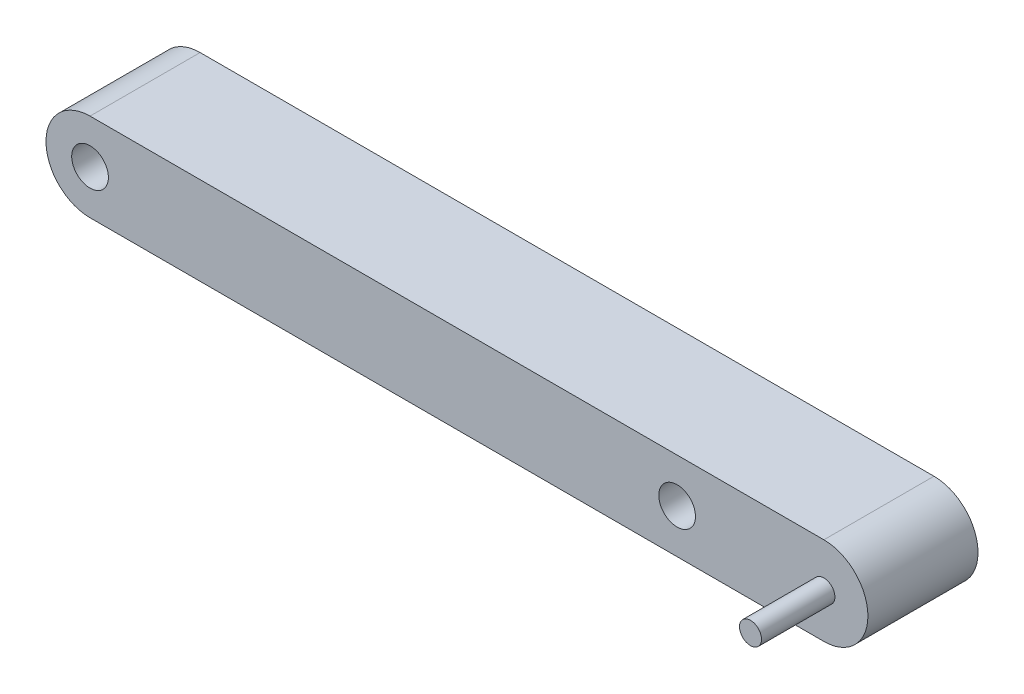
ISO-10303-21;
HEADER;
FILE_DESCRIPTION(('STEP AP214'),'2;1');
FILE_NAME('part.step','',(''),(''),'','','');
FILE_SCHEMA(('AUTOMOTIVE_DESIGN { 1 0 10303 214 1 1 1 1 }'));
ENDSEC;
DATA;
#1=APPLICATION_CONTEXT('core data for automotive mechanical design processes');
#2=APPLICATION_PROTOCOL_DEFINITION('international standard','automotive_design',2000,#1);
#3=PRODUCT_CONTEXT('',#1,'mechanical');
#4=PRODUCT('Part','Part','',(#3));
#5=PRODUCT_RELATED_PRODUCT_CATEGORY('part','',(#4));
#6=PRODUCT_DEFINITION_FORMATION('','',#4);
#7=PRODUCT_DEFINITION_CONTEXT('part definition',#1,'design');
#8=PRODUCT_DEFINITION('design','',#6,#7);
#9=PRODUCT_DEFINITION_SHAPE('','',#8);
#10=(LENGTH_UNIT() NAMED_UNIT(*) SI_UNIT(.MILLI.,.METRE.));
#11=(NAMED_UNIT(*) PLANE_ANGLE_UNIT() SI_UNIT($,.RADIAN.));
#12=(NAMED_UNIT(*) SI_UNIT($,.STERADIAN.) SOLID_ANGLE_UNIT());
#13=UNCERTAINTY_MEASURE_WITH_UNIT(LENGTH_MEASURE(1.E-05),#10,'distance_accuracy_value','');
#14=(GEOMETRIC_REPRESENTATION_CONTEXT(3) GLOBAL_UNCERTAINTY_ASSIGNED_CONTEXT((#13)) GLOBAL_UNIT_ASSIGNED_CONTEXT((#10,
#11,#12)) REPRESENTATION_CONTEXT('',''));
#15=CARTESIAN_POINT('',(0.,0.,0.));
#16=DIRECTION('',(0.,0.,1.));
#17=DIRECTION('',(1.,0.,0.));
#18=AXIS2_PLACEMENT_3D('',#15,#16,#17);
#19=CARTESIAN_POINT('',(100.,0.,25.));
#20=DIRECTION('',(0.,0.,-1.));
#21=DIRECTION('',(-1.,0.,0.));
#22=AXIS2_PLACEMENT_3D('',#19,#20,#21);
#23=CYLINDRICAL_SURFACE('',#22,1.5);
#24=CARTESIAN_POINT('',(100.,0.,25.));
#25=DIRECTION('',(0.,0.,1.));
#26=DIRECTION('',(1.,0.,0.));
#27=AXIS2_PLACEMENT_3D('',#24,#25,#26);
#28=CIRCLE('',#27,1.5);
#29=CARTESIAN_POINT('',(101.5,0.,25.));
#30=VERTEX_POINT('',#29);
#31=EDGE_CURVE('E11',#30,#30,#28,.T.);
#32=ORIENTED_EDGE('',*,*,#31,.F.);
#33=EDGE_LOOP('',(#32));
#34=FACE_BOUND('',#33,.T.);
#35=CARTESIAN_POINT('',(100.,0.,0.));
#36=DIRECTION('',(0.,0.,1.));
#37=DIRECTION('',(1.,0.,0.));
#38=AXIS2_PLACEMENT_3D('',#35,#36,#37);
#39=CIRCLE('',#38,1.5);
#40=CARTESIAN_POINT('',(101.5,0.,0.));
#41=VERTEX_POINT('',#40);
#42=EDGE_CURVE('E44',#41,#41,#39,.T.);
#43=ORIENTED_EDGE('',*,*,#42,.T.);
#44=EDGE_LOOP('',(#43));
#45=FACE_BOUND('',#44,.T.);
#46=ADVANCED_FACE('F41',(#34,#45),#23,.T.);
#47=CARTESIAN_POINT('',(100.,0.,25.));
#48=DIRECTION('',(0.,0.,1.));
#49=DIRECTION('',(1.,0.,0.));
#50=AXIS2_PLACEMENT_3D('',#47,#48,#49);
#51=PLANE('',#50);
#52=ORIENTED_EDGE('',*,*,#31,.T.);
#53=EDGE_LOOP('',(#52));
#54=FACE_BOUND('',#53,.T.);
#55=ADVANCED_FACE('F56',(#54),#51,.T.);
#56=CARTESIAN_POINT('',(100.,0.,0.));
#57=DIRECTION('',(0.,0.,1.));
#58=DIRECTION('',(1.,0.,0.));
#59=AXIS2_PLACEMENT_3D('',#56,#57,#58);
#60=PLANE('',#59);
#61=ORIENTED_EDGE('',*,*,#42,.F.);
#62=EDGE_LOOP('',(#61));
#63=FACE_BOUND('',#62,.T.);
#64=ADVANCED_FACE('F54',(#63),#60,.F.);
#65=CLOSED_SHELL('',(#46,#55,#64));
#66=MANIFOLD_SOLID_BREP('B2',#65);
#67=CARTESIAN_POINT('',(0.,0.,15.));
#68=DIRECTION('',(0.,0.,1.));
#69=DIRECTION('',(1.,0.,0.));
#70=AXIS2_PLACEMENT_3D('',#67,#68,#69);
#71=PLANE('',#70);
#72=CARTESIAN_POINT('',(80.,0.,15.));
#73=DIRECTION('',(0.,0.,1.));
#74=DIRECTION('',(1.,0.,0.));
#75=AXIS2_PLACEMENT_3D('',#72,#73,#74);
#76=CIRCLE('',#75,2.50000000000001);
#77=CARTESIAN_POINT('',(82.5,0.,15.));
#78=VERTEX_POINT('',#77);
#79=EDGE_CURVE('E164',#78,#78,#76,.T.);
#80=ORIENTED_EDGE('',*,*,#79,.F.);
#81=EDGE_LOOP('',(#80));
#82=FACE_BOUND('',#81,.T.);
#83=CARTESIAN_POINT('',(0.,0.,15.));
#84=DIRECTION('',(0.,0.,1.));
#85=DIRECTION('',(1.,0.,0.));
#86=AXIS2_PLACEMENT_3D('',#83,#84,#85);
#87=CIRCLE('',#86,6.);
#88=CARTESIAN_POINT('',(0.,6.,15.));
#89=VERTEX_POINT('',#88);
#90=CARTESIAN_POINT('',(0.,-6.,15.));
#91=VERTEX_POINT('',#90);
#92=EDGE_CURVE('E134',#89,#91,#87,.T.);
#93=ORIENTED_EDGE('',*,*,#92,.T.);
#94=DIRECTION('',(1.,0.,0.));
#95=VECTOR('',#94,1.);
#96=CARTESIAN_POINT('',(0.,-6.,15.));
#97=LINE('',#96,#95);
#98=CARTESIAN_POINT('',(100.,-6.,15.));
#99=VERTEX_POINT('',#98);
#100=EDGE_CURVE('E129',#91,#99,#97,.T.);
#101=ORIENTED_EDGE('',*,*,#100,.T.);
#102=CARTESIAN_POINT('',(100.,0.,15.));
#103=DIRECTION('',(0.,0.,1.));
#104=DIRECTION('',(1.,0.,0.));
#105=AXIS2_PLACEMENT_3D('',#102,#103,#104);
#106=CIRCLE('',#105,6.);
#107=CARTESIAN_POINT('',(100.,6.,15.));
#108=VERTEX_POINT('',#107);
#109=EDGE_CURVE('E132',#99,#108,#106,.T.);
#110=ORIENTED_EDGE('',*,*,#109,.T.);
#111=DIRECTION('',(-1.,0.,0.));
#112=VECTOR('',#111,1.);
#113=CARTESIAN_POINT('',(0.,6.,15.));
#114=LINE('',#113,#112);
#115=EDGE_CURVE('E99',#108,#89,#114,.T.);
#116=ORIENTED_EDGE('',*,*,#115,.T.);
#117=EDGE_LOOP('',(#93,#101,#110,#116));
#118=FACE_BOUND('',#117,.T.);
#119=CARTESIAN_POINT('',(0.,0.,15.));
#120=DIRECTION('',(0.,0.,1.));
#121=DIRECTION('',(1.,0.,0.));
#122=AXIS2_PLACEMENT_3D('',#119,#120,#121);
#123=CIRCLE('',#122,2.5);
#124=CARTESIAN_POINT('',(2.5,0.,15.));
#125=VERTEX_POINT('',#124);
#126=EDGE_CURVE('E149',#125,#125,#123,.T.);
#127=ORIENTED_EDGE('',*,*,#126,.F.);
#128=EDGE_LOOP('',(#127));
#129=FACE_BOUND('',#128,.T.);
#130=CARTESIAN_POINT('',(100.,0.,15.));
#131=DIRECTION('',(0.,0.,1.));
#132=DIRECTION('',(1.,0.,0.));
#133=AXIS2_PLACEMENT_3D('',#130,#131,#132);
#134=CIRCLE('',#133,1.5);
#135=CARTESIAN_POINT('',(101.5,0.,15.));
#136=VERTEX_POINT('',#135);
#137=EDGE_CURVE('E170',#136,#136,#134,.T.);
#138=ORIENTED_EDGE('',*,*,#137,.F.);
#139=EDGE_LOOP('',(#138));
#140=FACE_BOUND('',#139,.T.);
#141=ADVANCED_FACE('F82',(#82,#118,#129,#140),#71,.T.);
#142=CARTESIAN_POINT('',(0.,0.,0.));
#143=DIRECTION('',(0.,0.,1.));
#144=DIRECTION('',(1.,0.,0.));
#145=AXIS2_PLACEMENT_3D('',#142,#143,#144);
#146=PLANE('',#145);
#147=CARTESIAN_POINT('',(0.,0.,0.));
#148=DIRECTION('',(0.,0.,1.));
#149=DIRECTION('',(1.,0.,0.));
#150=AXIS2_PLACEMENT_3D('',#147,#148,#149);
#151=CIRCLE('',#150,6.);
#152=CARTESIAN_POINT('',(0.,6.,0.));
#153=VERTEX_POINT('',#152);
#154=CARTESIAN_POINT('',(0.,-6.,0.));
#155=VERTEX_POINT('',#154);
#156=EDGE_CURVE('E146',#153,#155,#151,.T.);
#157=ORIENTED_EDGE('',*,*,#156,.F.);
#158=DIRECTION('',(-1.,0.,0.));
#159=VECTOR('',#158,1.);
#160=CARTESIAN_POINT('',(0.,6.,0.));
#161=LINE('',#160,#159);
#162=CARTESIAN_POINT('',(100.,6.,0.));
#163=VERTEX_POINT('',#162);
#164=EDGE_CURVE('E122',#163,#153,#161,.T.);
#165=ORIENTED_EDGE('',*,*,#164,.F.);
#166=CARTESIAN_POINT('',(100.,0.,0.));
#167=DIRECTION('',(0.,0.,1.));
#168=DIRECTION('',(1.,0.,0.));
#169=AXIS2_PLACEMENT_3D('',#166,#167,#168);
#170=CIRCLE('',#169,6.);
#171=CARTESIAN_POINT('',(100.,-6.,0.));
#172=VERTEX_POINT('',#171);
#173=EDGE_CURVE('E116',#172,#163,#170,.T.);
#174=ORIENTED_EDGE('',*,*,#173,.F.);
#175=DIRECTION('',(1.,0.,0.));
#176=VECTOR('',#175,1.);
#177=CARTESIAN_POINT('',(0.,-6.,0.));
#178=LINE('',#177,#176);
#179=EDGE_CURVE('E138',#155,#172,#178,.T.);
#180=ORIENTED_EDGE('',*,*,#179,.F.);
#181=EDGE_LOOP('',(#157,#165,#174,#180));
#182=FACE_BOUND('',#181,.T.);
#183=CARTESIAN_POINT('',(0.,0.,0.));
#184=DIRECTION('',(0.,0.,1.));
#185=DIRECTION('',(1.,0.,0.));
#186=AXIS2_PLACEMENT_3D('',#183,#184,#185);
#187=CIRCLE('',#186,2.5);
#188=CARTESIAN_POINT('',(2.5,0.,0.));
#189=VERTEX_POINT('',#188);
#190=EDGE_CURVE('E161',#189,#189,#187,.T.);
#191=ORIENTED_EDGE('',*,*,#190,.T.);
#192=EDGE_LOOP('',(#191));
#193=FACE_BOUND('',#192,.T.);
#194=CARTESIAN_POINT('',(80.,0.,0.));
#195=DIRECTION('',(0.,0.,1.));
#196=DIRECTION('',(1.,0.,0.));
#197=AXIS2_PLACEMENT_3D('',#194,#195,#196);
#198=CIRCLE('',#197,2.50000000000001);
#199=CARTESIAN_POINT('',(82.5,0.,0.));
#200=VERTEX_POINT('',#199);
#201=EDGE_CURVE('E167',#200,#200,#198,.T.);
#202=ORIENTED_EDGE('',*,*,#201,.T.);
#203=EDGE_LOOP('',(#202));
#204=FACE_BOUND('',#203,.T.);
#205=CARTESIAN_POINT('',(100.,0.,0.));
#206=DIRECTION('',(0.,0.,1.));
#207=DIRECTION('',(1.,0.,0.));
#208=AXIS2_PLACEMENT_3D('',#205,#206,#207);
#209=CIRCLE('',#208,1.5);
#210=CARTESIAN_POINT('',(101.5,0.,0.));
#211=VERTEX_POINT('',#210);
#212=EDGE_CURVE('E173',#211,#211,#209,.T.);
#213=ORIENTED_EDGE('',*,*,#212,.T.);
#214=EDGE_LOOP('',(#213));
#215=FACE_BOUND('',#214,.T.);
#216=ADVANCED_FACE('F157',(#182,#193,#204,#215),#146,.F.);
#217=CARTESIAN_POINT('',(0.,0.,15.));
#218=DIRECTION('',(0.,0.,-1.));
#219=DIRECTION('',(-1.,0.,0.));
#220=AXIS2_PLACEMENT_3D('',#217,#218,#219);
#221=CYLINDRICAL_SURFACE('',#220,6.);
#222=ORIENTED_EDGE('',*,*,#156,.T.);
#223=DIRECTION('',(0.,0.,-1.));
#224=VECTOR('',#223,1.);
#225=CARTESIAN_POINT('',(0.,-6.,15.));
#226=LINE('',#225,#224);
#227=EDGE_CURVE('E39',#91,#155,#226,.T.);
#228=ORIENTED_EDGE('',*,*,#227,.F.);
#229=ORIENTED_EDGE('',*,*,#92,.F.);
#230=DIRECTION('',(0.,0.,-1.));
#231=VECTOR('',#230,1.);
#232=CARTESIAN_POINT('',(0.,6.,15.));
#233=LINE('',#232,#231);
#234=EDGE_CURVE('E142',#89,#153,#233,.T.);
#235=ORIENTED_EDGE('',*,*,#234,.T.);
#236=EDGE_LOOP('',(#222,#228,#229,#235));
#237=FACE_BOUND('',#236,.T.);
#238=ADVANCED_FACE('F84',(#237),#221,.T.);
#239=CARTESIAN_POINT('',(0.,-6.,15.));
#240=DIRECTION('',(0.,1.,0.));
#241=DIRECTION('',(-1.,0.,0.));
#242=AXIS2_PLACEMENT_3D('',#239,#240,#241);
#243=PLANE('',#242);
#244=ORIENTED_EDGE('',*,*,#179,.T.);
#245=DIRECTION('',(0.,0.,-1.));
#246=VECTOR('',#245,1.);
#247=CARTESIAN_POINT('',(100.,-6.,15.));
#248=LINE('',#247,#246);
#249=EDGE_CURVE('E91',#99,#172,#248,.T.);
#250=ORIENTED_EDGE('',*,*,#249,.F.);
#251=ORIENTED_EDGE('',*,*,#100,.F.);
#252=ORIENTED_EDGE('',*,*,#227,.T.);
#253=EDGE_LOOP('',(#244,#250,#251,#252));
#254=FACE_BOUND('',#253,.T.);
#255=ADVANCED_FACE('F137',(#254),#243,.F.);
#256=CARTESIAN_POINT('',(100.,0.,15.));
#257=DIRECTION('',(0.,0.,-1.));
#258=DIRECTION('',(-1.,0.,0.));
#259=AXIS2_PLACEMENT_3D('',#256,#257,#258);
#260=CYLINDRICAL_SURFACE('',#259,6.);
#261=ORIENTED_EDGE('',*,*,#173,.T.);
#262=DIRECTION('',(0.,0.,-1.));
#263=VECTOR('',#262,1.);
#264=CARTESIAN_POINT('',(100.,6.,15.));
#265=LINE('',#264,#263);
#266=EDGE_CURVE('E139',#108,#163,#265,.T.);
#267=ORIENTED_EDGE('',*,*,#266,.F.);
#268=ORIENTED_EDGE('',*,*,#109,.F.);
#269=ORIENTED_EDGE('',*,*,#249,.T.);
#270=EDGE_LOOP('',(#261,#267,#268,#269));
#271=FACE_BOUND('',#270,.T.);
#272=ADVANCED_FACE('F140',(#271),#260,.T.);
#273=CARTESIAN_POINT('',(0.,6.,15.));
#274=DIRECTION('',(0.,-1.,0.));
#275=DIRECTION('',(1.,0.,0.));
#276=AXIS2_PLACEMENT_3D('',#273,#274,#275);
#277=PLANE('',#276);
#278=ORIENTED_EDGE('',*,*,#164,.T.);
#279=ORIENTED_EDGE('',*,*,#234,.F.);
#280=ORIENTED_EDGE('',*,*,#115,.F.);
#281=ORIENTED_EDGE('',*,*,#266,.T.);
#282=EDGE_LOOP('',(#278,#279,#280,#281));
#283=FACE_BOUND('',#282,.T.);
#284=ADVANCED_FACE('F154',(#283),#277,.F.);
#285=CARTESIAN_POINT('',(0.,0.,15.));
#286=DIRECTION('',(0.,0.,-1.));
#287=DIRECTION('',(-1.,0.,0.));
#288=AXIS2_PLACEMENT_3D('',#285,#286,#287);
#289=CYLINDRICAL_SURFACE('',#288,2.5);
#290=ORIENTED_EDGE('',*,*,#126,.T.);
#291=EDGE_LOOP('',(#290));
#292=FACE_BOUND('',#291,.T.);
#293=ORIENTED_EDGE('',*,*,#190,.F.);
#294=EDGE_LOOP('',(#293));
#295=FACE_BOUND('',#294,.T.);
#296=ADVANCED_FACE('F191',(#292,#295),#289,.F.);
#297=CARTESIAN_POINT('',(80.,0.,15.));
#298=DIRECTION('',(0.,0.,-1.));
#299=DIRECTION('',(-1.,0.,0.));
#300=AXIS2_PLACEMENT_3D('',#297,#298,#299);
#301=CYLINDRICAL_SURFACE('',#300,2.50000000000001);
#302=ORIENTED_EDGE('',*,*,#79,.T.);
#303=EDGE_LOOP('',(#302));
#304=FACE_BOUND('',#303,.T.);
#305=ORIENTED_EDGE('',*,*,#201,.F.);
#306=EDGE_LOOP('',(#305));
#307=FACE_BOUND('',#306,.T.);
#308=ADVANCED_FACE('F237',(#304,#307),#301,.F.);
#309=CARTESIAN_POINT('',(100.,0.,15.));
#310=DIRECTION('',(0.,0.,-1.));
#311=DIRECTION('',(-1.,0.,0.));
#312=AXIS2_PLACEMENT_3D('',#309,#310,#311);
#313=CYLINDRICAL_SURFACE('',#312,1.5);
#314=ORIENTED_EDGE('',*,*,#137,.T.);
#315=EDGE_LOOP('',(#314));
#316=FACE_BOUND('',#315,.T.);
#317=ORIENTED_EDGE('',*,*,#212,.F.);
#318=EDGE_LOOP('',(#317));
#319=FACE_BOUND('',#318,.T.);
#320=ADVANCED_FACE('F179',(#316,#319),#313,.F.);
#321=CLOSED_SHELL('',(#141,#216,#238,#255,#272,#284,#296,#308,#320));
#322=MANIFOLD_SOLID_BREP('B6',#321);
#323=ADVANCED_BREP_SHAPE_REPRESENTATION('',(#18,#66,#322),#14);
#324=SHAPE_DEFINITION_REPRESENTATION(#9,#323);
ENDSEC;
END-ISO-10303-21;
